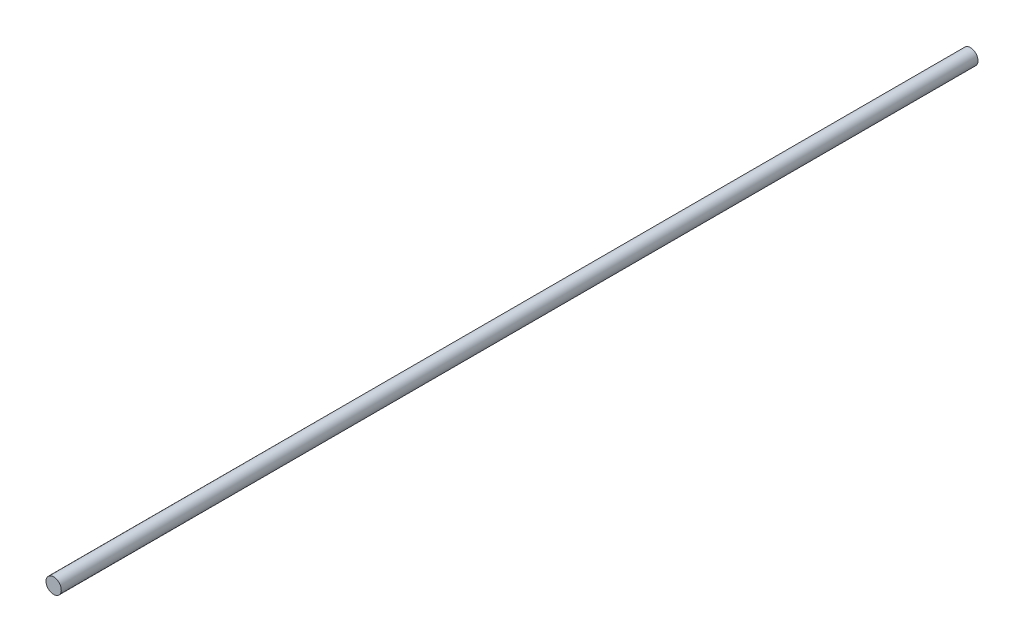
ISO-10303-21;
HEADER;
FILE_DESCRIPTION(('STEP AP214'),'2;1');
FILE_NAME('part.step','',(''),(''),'','','');
FILE_SCHEMA(('AUTOMOTIVE_DESIGN { 1 0 10303 214 1 1 1 1 }'));
ENDSEC;
DATA;
#1=APPLICATION_CONTEXT('core data for automotive mechanical design processes');
#2=APPLICATION_PROTOCOL_DEFINITION('international standard','automotive_design',2000,#1);
#3=PRODUCT_CONTEXT('',#1,'mechanical');
#4=PRODUCT('Part','Part','',(#3));
#5=PRODUCT_RELATED_PRODUCT_CATEGORY('part','',(#4));
#6=PRODUCT_DEFINITION_FORMATION('','',#4);
#7=PRODUCT_DEFINITION_CONTEXT('part definition',#1,'design');
#8=PRODUCT_DEFINITION('design','',#6,#7);
#9=PRODUCT_DEFINITION_SHAPE('','',#8);
#10=(LENGTH_UNIT() NAMED_UNIT(*) SI_UNIT(.MILLI.,.METRE.));
#11=(NAMED_UNIT(*) PLANE_ANGLE_UNIT() SI_UNIT($,.RADIAN.));
#12=(NAMED_UNIT(*) SI_UNIT($,.STERADIAN.) SOLID_ANGLE_UNIT());
#13=UNCERTAINTY_MEASURE_WITH_UNIT(LENGTH_MEASURE(1.E-05),#10,'distance_accuracy_value','');
#14=(GEOMETRIC_REPRESENTATION_CONTEXT(3) GLOBAL_UNCERTAINTY_ASSIGNED_CONTEXT((#13)) GLOBAL_UNIT_ASSIGNED_CONTEXT((#10,
#11,#12)) REPRESENTATION_CONTEXT('',''));
#15=CARTESIAN_POINT('',(0.,0.,0.));
#16=DIRECTION('',(0.,0.,1.));
#17=DIRECTION('',(1.,0.,0.));
#18=AXIS2_PLACEMENT_3D('',#15,#16,#17);
#19=CARTESIAN_POINT('',(0.,2.78233861551044,762.));
#20=DIRECTION('',(0.,0.,-1.));
#21=DIRECTION('',(-1.,0.,0.));
#22=AXIS2_PLACEMENT_3D('',#19,#20,#21);
#23=CYLINDRICAL_SURFACE('',#22,6.35);
#24=CARTESIAN_POINT('',(0.,2.78233861551044,762.));
#25=DIRECTION('',(0.,0.,1.));
#26=DIRECTION('',(1.,0.,0.));
#27=AXIS2_PLACEMENT_3D('',#24,#25,#26);
#28=CIRCLE('',#27,6.35);
#29=CARTESIAN_POINT('',(6.35,2.78233861551044,762.));
#30=VERTEX_POINT('',#29);
#31=EDGE_CURVE('E10',#30,#30,#28,.T.);
#32=ORIENTED_EDGE('',*,*,#31,.F.);
#33=EDGE_LOOP('',(#32));
#34=FACE_BOUND('',#33,.T.);
#35=CARTESIAN_POINT('',(0.,2.78233861551044,0.));
#36=DIRECTION('',(0.,0.,1.));
#37=DIRECTION('',(1.,0.,0.));
#38=AXIS2_PLACEMENT_3D('',#35,#36,#37);
#39=CIRCLE('',#38,6.35);
#40=CARTESIAN_POINT('',(6.35,2.78233861551044,0.));
#41=VERTEX_POINT('',#40);
#42=EDGE_CURVE('E46',#41,#41,#39,.T.);
#43=ORIENTED_EDGE('',*,*,#42,.T.);
#44=EDGE_LOOP('',(#43));
#45=FACE_BOUND('',#44,.T.);
#46=ADVANCED_FACE('F43',(#34,#45),#23,.T.);
#47=CARTESIAN_POINT('',(0.,2.78233861551044,762.));
#48=DIRECTION('',(0.,0.,1.));
#49=DIRECTION('',(1.,0.,0.));
#50=AXIS2_PLACEMENT_3D('',#47,#48,#49);
#51=PLANE('',#50);
#52=ORIENTED_EDGE('',*,*,#31,.T.);
#53=EDGE_LOOP('',(#52));
#54=FACE_BOUND('',#53,.T.);
#55=ADVANCED_FACE('F59',(#54),#51,.T.);
#56=CARTESIAN_POINT('',(0.,2.78233861551044,0.));
#57=DIRECTION('',(0.,0.,1.));
#58=DIRECTION('',(1.,0.,0.));
#59=AXIS2_PLACEMENT_3D('',#56,#57,#58);
#60=PLANE('',#59);
#61=ORIENTED_EDGE('',*,*,#42,.F.);
#62=EDGE_LOOP('',(#61));
#63=FACE_BOUND('',#62,.T.);
#64=ADVANCED_FACE('F57',(#63),#60,.F.);
#65=CLOSED_SHELL('',(#46,#55,#64));
#66=MANIFOLD_SOLID_BREP('B2',#65);
#67=ADVANCED_BREP_SHAPE_REPRESENTATION('',(#18,#66),#14);
#68=SHAPE_DEFINITION_REPRESENTATION(#9,#67);
ENDSEC;
END-ISO-10303-21;
